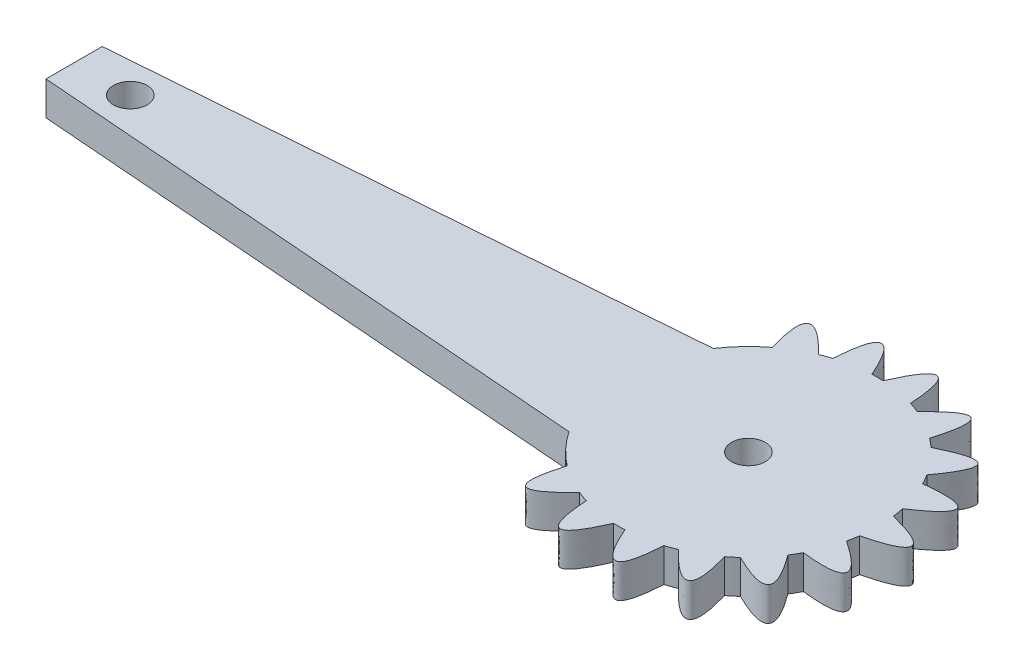
ISO-10303-21;
HEADER;
FILE_DESCRIPTION(('STEP AP214'),'2;1');
FILE_NAME('part.step','',(''),(''),'','','');
FILE_SCHEMA(('AUTOMOTIVE_DESIGN { 1 0 10303 214 1 1 1 1 }'));
ENDSEC;
DATA;
#1=APPLICATION_CONTEXT('core data for automotive mechanical design processes');
#2=APPLICATION_PROTOCOL_DEFINITION('international standard','automotive_design',2000,#1);
#3=PRODUCT_CONTEXT('',#1,'mechanical');
#4=PRODUCT('Part','Part','',(#3));
#5=PRODUCT_RELATED_PRODUCT_CATEGORY('part','',(#4));
#6=PRODUCT_DEFINITION_FORMATION('','',#4);
#7=PRODUCT_DEFINITION_CONTEXT('part definition',#1,'design');
#8=PRODUCT_DEFINITION('design','',#6,#7);
#9=PRODUCT_DEFINITION_SHAPE('','',#8);
#10=(LENGTH_UNIT() NAMED_UNIT(*) SI_UNIT(.MILLI.,.METRE.));
#11=(NAMED_UNIT(*) PLANE_ANGLE_UNIT() SI_UNIT($,.RADIAN.));
#12=(NAMED_UNIT(*) SI_UNIT($,.STERADIAN.) SOLID_ANGLE_UNIT());
#13=UNCERTAINTY_MEASURE_WITH_UNIT(LENGTH_MEASURE(1.E-05),#10,'distance_accuracy_value','');
#14=(GEOMETRIC_REPRESENTATION_CONTEXT(3) GLOBAL_UNCERTAINTY_ASSIGNED_CONTEXT((#13)) GLOBAL_UNIT_ASSIGNED_CONTEXT((#10,
#11,#12)) REPRESENTATION_CONTEXT('',''));
#15=CARTESIAN_POINT('',(0.,0.,0.));
#16=DIRECTION('',(0.,0.,1.));
#17=DIRECTION('',(1.,0.,0.));
#18=AXIS2_PLACEMENT_3D('',#15,#16,#17);
#19=CARTESIAN_POINT('',(52.9992435664006,3.,-15.6235634133468));
#20=CARTESIAN_POINT('',(51.2008079529003,3.,-21.7406476911319));
#21=CARTESIAN_POINT('',(55.5991405278024,3.,-17.1246146238774));
#22=B_SPLINE_CURVE_WITH_KNOTS('',2,(#19,#20,#21),.UNSPECIFIED.,.F.,.F.,(3,3),(0.,1.),.UNSPECIFIED.);
#23=DIRECTION('',(0.,-1.,0.));
#24=VECTOR('',#23,1.);
#25=SURFACE_OF_LINEAR_EXTRUSION('',#22,#24);
#26=CARTESIAN_POINT('',(52.9992435664006,0.,-15.6235634133468));
#27=CARTESIAN_POINT('',(51.2008079529003,0.,-21.7406476911319));
#28=CARTESIAN_POINT('',(55.5991405278024,0.,-17.1246146238774));
#29=B_SPLINE_CURVE_WITH_KNOTS('',2,(#26,#27,#28),.UNSPECIFIED.,.F.,.F.,(3,3),(0.,1.),.UNSPECIFIED.);
#30=CARTESIAN_POINT('',(52.9992435663991,0.,-15.6235634133487));
#31=VERTEX_POINT('',#30);
#32=CARTESIAN_POINT('',(55.5991405278014,0.,-17.1246146238798));
#33=VERTEX_POINT('',#32);
#34=EDGE_CURVE('E520',#31,#33,#29,.T.);
#35=ORIENTED_EDGE('',*,*,#34,.F.);
#36=DIRECTION('',(0.,-1.,0.));
#37=VECTOR('',#36,1.);
#38=CARTESIAN_POINT('',(52.9992435663991,3.,-15.6235634133487));
#39=LINE('',#38,#37);
#40=CARTESIAN_POINT('',(52.9992435663991,3.,-15.6235634133487));
#41=VERTEX_POINT('',#40);
#42=EDGE_CURVE('E11',#41,#31,#39,.T.);
#43=ORIENTED_EDGE('',*,*,#42,.F.);
#44=CARTESIAN_POINT('',(55.5991405278014,3.,-17.1246146238798));
#45=VERTEX_POINT('',#44);
#46=EDGE_CURVE('E435',#41,#45,#22,.T.);
#47=ORIENTED_EDGE('',*,*,#46,.T.);
#48=DIRECTION('',(0.,-1.,0.));
#49=VECTOR('',#48,1.);
#50=CARTESIAN_POINT('',(55.5991405278014,3.,-17.1246146238798));
#51=LINE('',#50,#49);
#52=EDGE_CURVE('E158',#45,#33,#51,.T.);
#53=ORIENTED_EDGE('',*,*,#52,.T.);
#54=EDGE_LOOP('',(#35,#43,#47,#53));
#55=FACE_BOUND('',#54,.T.);
#56=ADVANCED_FACE('F41',(#55),#25,.T.);
#57=CARTESIAN_POINT('',(60.,3.,-6.5));
#58=DIRECTION('',(0.,-1.,0.));
#59=DIRECTION('',(0.,0.,-1.));
#60=AXIS2_PLACEMENT_3D('',#57,#58,#59);
#61=CYLINDRICAL_SURFACE('',#60,11.5);
#62=CARTESIAN_POINT('',(60.,0.,-6.5));
#63=DIRECTION('',(0.,1.,0.));
#64=DIRECTION('',(0.,0.,1.));
#65=AXIS2_PLACEMENT_3D('',#62,#63,#64);
#66=CIRCLE('',#65,11.5);
#67=CARTESIAN_POINT('',(50.4582320769603,0.,-12.91908598656));
#68=VERTEX_POINT('',#67);
#69=EDGE_CURVE('E516',#31,#68,#66,.T.);
#70=ORIENTED_EDGE('',*,*,#69,.T.);
#71=DIRECTION('',(0.,-1.,0.));
#72=VECTOR('',#71,1.);
#73=CARTESIAN_POINT('',(50.4582320769603,3.,-12.91908598656));
#74=LINE('',#73,#72);
#75=CARTESIAN_POINT('',(50.4582320769603,3.,-12.91908598656));
#76=VERTEX_POINT('',#75);
#77=EDGE_CURVE('E50',#76,#68,#74,.T.);
#78=ORIENTED_EDGE('',*,*,#77,.F.);
#79=CARTESIAN_POINT('',(60.,3.,-6.5));
#80=DIRECTION('',(0.,1.,0.));
#81=DIRECTION('',(0.,0.,1.));
#82=AXIS2_PLACEMENT_3D('',#79,#80,#81);
#83=CIRCLE('',#82,11.5);
#84=EDGE_CURVE('E267',#41,#76,#83,.T.);
#85=ORIENTED_EDGE('',*,*,#84,.F.);
#86=ORIENTED_EDGE('',*,*,#42,.T.);
#87=EDGE_LOOP('',(#70,#78,#85,#86));
#88=FACE_BOUND('',#87,.T.);
#89=ADVANCED_FACE('F517',(#88),#61,.T.);
#90=CARTESIAN_POINT('',(-0.69483744026984,3.,-8.94603204347418));
#91=DIRECTION('',(-0.0774366813208004,0.,-0.996997272005305));
#92=DIRECTION('',(-0.996997272005305,0.,0.0774366813208004));
#93=AXIS2_PLACEMENT_3D('',#90,#91,#92);
#94=PLANE('',#93);
#95=DIRECTION('',(0.996997272005305,0.,-0.0774366813208004));
#96=VECTOR('',#95,1.);
#97=CARTESIAN_POINT('',(-0.69483744026984,0.,-8.94603204347418));
#98=LINE('',#97,#96);
#99=CARTESIAN_POINT('',(0.,0.,-9.));
#100=VERTEX_POINT('',#99);
#101=EDGE_CURVE('E511',#100,#68,#98,.T.);
#102=ORIENTED_EDGE('',*,*,#101,.F.);
#103=DIRECTION('',(0.,-1.,0.));
#104=VECTOR('',#103,1.);
#105=CARTESIAN_POINT('',(0.,3.,-9.));
#106=LINE('',#105,#104);
#107=CARTESIAN_POINT('',(0.,3.,-9.));
#108=VERTEX_POINT('',#107);
#109=EDGE_CURVE('E504',#108,#100,#106,.T.);
#110=ORIENTED_EDGE('',*,*,#109,.F.);
#111=DIRECTION('',(0.996997272005305,0.,-0.0774366813208004));
#112=VECTOR('',#111,1.);
#113=CARTESIAN_POINT('',(-0.69483744026984,3.,-8.94603204347418));
#114=LINE('',#113,#112);
#115=EDGE_CURVE('E433',#108,#76,#114,.T.);
#116=ORIENTED_EDGE('',*,*,#115,.T.);
#117=ORIENTED_EDGE('',*,*,#77,.T.);
#118=EDGE_LOOP('',(#102,#110,#116,#117));
#119=FACE_BOUND('',#118,.T.);
#120=ADVANCED_FACE('F509',(#119),#94,.T.);
#121=CARTESIAN_POINT('',(0.,3.,0.));
#122=DIRECTION('',(-1.,0.,0.));
#123=DIRECTION('',(0.,0.,1.));
#124=AXIS2_PLACEMENT_3D('',#121,#122,#123);
#125=PLANE('',#124);
#126=DIRECTION('',(0.,0.,-1.));
#127=VECTOR('',#126,1.);
#128=CARTESIAN_POINT('',(0.,0.,0.));
#129=LINE('',#128,#127);
#130=CARTESIAN_POINT('',(0.,0.,-4.));
#131=VERTEX_POINT('',#130);
#132=EDGE_CURVE('E527',#131,#100,#129,.T.);
#133=ORIENTED_EDGE('',*,*,#132,.F.);
#134=DIRECTION('',(0.,-1.,0.));
#135=VECTOR('',#134,1.);
#136=CARTESIAN_POINT('',(0.,3.,-4.));
#137=LINE('',#136,#135);
#138=CARTESIAN_POINT('',(0.,3.,-4.));
#139=VERTEX_POINT('',#138);
#140=EDGE_CURVE('E502',#139,#131,#137,.T.);
#141=ORIENTED_EDGE('',*,*,#140,.F.);
#142=DIRECTION('',(0.,0.,-1.));
#143=VECTOR('',#142,1.);
#144=CARTESIAN_POINT('',(0.,3.,0.));
#145=LINE('',#144,#143);
#146=EDGE_CURVE('E430',#139,#108,#145,.T.);
#147=ORIENTED_EDGE('',*,*,#146,.T.);
#148=ORIENTED_EDGE('',*,*,#109,.T.);
#149=EDGE_LOOP('',(#133,#141,#147,#148));
#150=FACE_BOUND('',#149,.T.);
#151=ADVANCED_FACE('F1095',(#150),#125,.T.);
#152=CARTESIAN_POINT('',(0.308816640119929,3.,-3.97601424154408));
#153=DIRECTION('',(0.0774366813208004,0.,-0.996997272005305));
#154=DIRECTION('',(-0.996997272005305,0.,-0.0774366813208004));
#155=AXIS2_PLACEMENT_3D('',#152,#153,#154);
#156=PLANE('',#155);
#157=DIRECTION('',(0.996997272005305,0.,0.0774366813208004));
#158=VECTOR('',#157,1.);
#159=CARTESIAN_POINT('',(0.308816640119929,0.,-3.97601424154408));
#160=LINE('',#159,#158);
#161=CARTESIAN_POINT('',(50.4582320769603,0.,-0.0809140134399738));
#162=VERTEX_POINT('',#161);
#163=EDGE_CURVE('E529',#131,#162,#160,.T.);
#164=ORIENTED_EDGE('',*,*,#163,.T.);
#165=DIRECTION('',(0.,-1.,0.));
#166=VECTOR('',#165,1.);
#167=CARTESIAN_POINT('',(50.4582320769603,3.,-0.0809140134399738));
#168=LINE('',#167,#166);
#169=CARTESIAN_POINT('',(50.4582320769603,3.,-0.0809140134399738));
#170=VERTEX_POINT('',#169);
#171=EDGE_CURVE('E499',#170,#162,#168,.T.);
#172=ORIENTED_EDGE('',*,*,#171,.F.);
#173=DIRECTION('',(0.996997272005305,0.,0.0774366813208004));
#174=VECTOR('',#173,1.);
#175=CARTESIAN_POINT('',(0.308816640119929,3.,-3.97601424154408));
#176=LINE('',#175,#174);
#177=EDGE_CURVE('E425',#139,#170,#176,.T.);
#178=ORIENTED_EDGE('',*,*,#177,.F.);
#179=ORIENTED_EDGE('',*,*,#140,.T.);
#180=EDGE_LOOP('',(#164,#172,#178,#179));
#181=FACE_BOUND('',#180,.T.);
#182=ADVANCED_FACE('F728',(#181),#156,.F.);
#183=CARTESIAN_POINT('',(52.9992435664049,0.,2.62356341335322));
#184=VERTEX_POINT('',#183);
#185=EDGE_CURVE('E522',#162,#184,#66,.T.);
#186=ORIENTED_EDGE('',*,*,#185,.T.);
#187=DIRECTION('',(0.,-1.,0.));
#188=VECTOR('',#187,1.);
#189=CARTESIAN_POINT('',(52.9992435664049,3.,2.62356341335322));
#190=LINE('',#189,#188);
#191=CARTESIAN_POINT('',(52.9992435664049,3.,2.62356341335322));
#192=VERTEX_POINT('',#191);
#193=EDGE_CURVE('E497',#192,#184,#190,.T.);
#194=ORIENTED_EDGE('',*,*,#193,.F.);
#195=EDGE_CURVE('E424',#170,#192,#83,.T.);
#196=ORIENTED_EDGE('',*,*,#195,.F.);
#197=ORIENTED_EDGE('',*,*,#171,.T.);
#198=EDGE_LOOP('',(#186,#194,#196,#197));
#199=FACE_BOUND('',#198,.T.);
#200=ADVANCED_FACE('F681',(#199),#61,.T.);
#201=CARTESIAN_POINT('',(55.5991405278086,3.,4.12461462388139));
#202=CARTESIAN_POINT('',(51.2008079529064,3.,8.74064769113579));
#203=CARTESIAN_POINT('',(52.9992435664068,3.,2.62356341335077));
#204=B_SPLINE_CURVE_WITH_KNOTS('',2,(#201,#202,#203),.UNSPECIFIED.,.F.,.F.,(3,3),(0.,1.),.UNSPECIFIED.);
#205=DIRECTION('',(0.,-1.,0.));
#206=VECTOR('',#205,1.);
#207=SURFACE_OF_LINEAR_EXTRUSION('',#204,#206);
#208=CARTESIAN_POINT('',(55.5991405278086,0.,4.12461462388139));
#209=CARTESIAN_POINT('',(51.2008079529064,0.,8.74064769113579));
#210=CARTESIAN_POINT('',(52.9992435664068,0.,2.62356341335077));
#211=B_SPLINE_CURVE_WITH_KNOTS('',2,(#208,#209,#210),.UNSPECIFIED.,.F.,.F.,(3,3),(0.,1.),.UNSPECIFIED.);
#212=CARTESIAN_POINT('',(55.5991405278081,0.,4.12461462388254));
#213=VERTEX_POINT('',#212);
#214=EDGE_CURVE('E534',#213,#184,#211,.T.);
#215=ORIENTED_EDGE('',*,*,#214,.F.);
#216=DIRECTION('',(0.,-1.,0.));
#217=VECTOR('',#216,1.);
#218=CARTESIAN_POINT('',(55.5991405278081,3.,4.12461462388254));
#219=LINE('',#218,#217);
#220=CARTESIAN_POINT('',(55.5991405278081,3.,4.12461462388254));
#221=VERTEX_POINT('',#220);
#222=EDGE_CURVE('E495',#221,#213,#219,.T.);
#223=ORIENTED_EDGE('',*,*,#222,.F.);
#224=EDGE_CURVE('E415',#221,#192,#204,.T.);
#225=ORIENTED_EDGE('',*,*,#224,.T.);
#226=ORIENTED_EDGE('',*,*,#193,.T.);
#227=EDGE_LOOP('',(#215,#223,#225,#226));
#228=FACE_BOUND('',#227,.T.);
#229=ADVANCED_FACE('F405',(#228),#207,.T.);
#230=CARTESIAN_POINT('',(56.5418833057077,0.,4.46774493360676));
#231=VERTEX_POINT('',#230);
#232=EDGE_CURVE('E539',#213,#231,#66,.T.);
#233=ORIENTED_EDGE('',*,*,#232,.T.);
#234=DIRECTION('',(0.,-1.,0.));
#235=VECTOR('',#234,1.);
#236=CARTESIAN_POINT('',(56.5418833057077,3.,4.46774493360676));
#237=LINE('',#236,#235);
#238=CARTESIAN_POINT('',(56.5418833057077,3.,4.46774493360676));
#239=VERTEX_POINT('',#238);
#240=EDGE_CURVE('E493',#239,#231,#237,.T.);
#241=ORIENTED_EDGE('',*,*,#240,.F.);
#242=EDGE_CURVE('E414',#221,#239,#83,.T.);
#243=ORIENTED_EDGE('',*,*,#242,.F.);
#244=ORIENTED_EDGE('',*,*,#222,.T.);
#245=EDGE_LOOP('',(#233,#241,#243,#244));
#246=FACE_BOUND('',#245,.T.);
#247=ADVANCED_FACE('F403',(#246),#61,.T.);
#248=CARTESIAN_POINT('',(59.4983770453061,3.,4.98905454819171));
#249=CARTESIAN_POINT('',(56.9440726721666,3.,10.8310250964564));
#250=CARTESIAN_POINT('',(56.5418833057083,3.,4.46774493360494));
#251=B_SPLINE_CURVE_WITH_KNOTS('',2,(#248,#249,#250),.UNSPECIFIED.,.F.,.F.,(3,3),(0.,1.),.UNSPECIFIED.);
#252=DIRECTION('',(0.,-1.,0.));
#253=VECTOR('',#252,1.);
#254=SURFACE_OF_LINEAR_EXTRUSION('',#251,#253);
#255=CARTESIAN_POINT('',(59.4983770453061,0.,4.98905454819171));
#256=CARTESIAN_POINT('',(56.9440726721666,0.,10.8310250964564));
#257=CARTESIAN_POINT('',(56.5418833057083,0.,4.46774493360494));
#258=B_SPLINE_CURVE_WITH_KNOTS('',2,(#255,#256,#257),.UNSPECIFIED.,.F.,.F.,(3,3),(0.,1.),.UNSPECIFIED.);
#259=CARTESIAN_POINT('',(59.4983770453061,0.,4.98905454819168));
#260=VERTEX_POINT('',#259);
#261=EDGE_CURVE('E540',#260,#231,#258,.T.);
#262=ORIENTED_EDGE('',*,*,#261,.F.);
#263=DIRECTION('',(0.,-1.,0.));
#264=VECTOR('',#263,1.);
#265=CARTESIAN_POINT('',(59.4983770453061,3.,4.98905454819168));
#266=LINE('',#265,#264);
#267=CARTESIAN_POINT('',(59.4983770453061,3.,4.98905454819168));
#268=VERTEX_POINT('',#267);
#269=EDGE_CURVE('E491',#268,#260,#266,.T.);
#270=ORIENTED_EDGE('',*,*,#269,.F.);
#271=EDGE_CURVE('E408',#268,#239,#251,.T.);
#272=ORIENTED_EDGE('',*,*,#271,.T.);
#273=ORIENTED_EDGE('',*,*,#240,.T.);
#274=EDGE_LOOP('',(#262,#270,#272,#273));
#275=FACE_BOUND('',#274,.T.);
#276=ADVANCED_FACE('F400',(#275),#254,.T.);
#277=CARTESIAN_POINT('',(60.5016229547086,0.,4.98905454819104));
#278=VERTEX_POINT('',#277);
#279=EDGE_CURVE('E548',#260,#278,#66,.T.);
#280=ORIENTED_EDGE('',*,*,#279,.T.);
#281=DIRECTION('',(0.,-1.,0.));
#282=VECTOR('',#281,1.);
#283=CARTESIAN_POINT('',(60.5016229547086,3.,4.98905454819104));
#284=LINE('',#283,#282);
#285=CARTESIAN_POINT('',(60.5016229547086,3.,4.98905454819104));
#286=VERTEX_POINT('',#285);
#287=EDGE_CURVE('E489',#286,#278,#284,.T.);
#288=ORIENTED_EDGE('',*,*,#287,.F.);
#289=EDGE_CURVE('E413',#268,#286,#83,.T.);
#290=ORIENTED_EDGE('',*,*,#289,.F.);
#291=ORIENTED_EDGE('',*,*,#269,.T.);
#292=EDGE_LOOP('',(#280,#288,#290,#291));
#293=FACE_BOUND('',#292,.T.);
#294=ADVANCED_FACE('F398',(#293),#61,.T.);
#295=CARTESIAN_POINT('',(63.4581166943064,3.,4.46774493360369));
#296=CARTESIAN_POINT('',(63.0559273278479,3.,10.8310250964552));
#297=CARTESIAN_POINT('',(60.5016229547086,3.,4.98905454819043));
#298=B_SPLINE_CURVE_WITH_KNOTS('',2,(#295,#296,#297),.UNSPECIFIED.,.F.,.F.,(3,3),(0.,1.),.UNSPECIFIED.);
#299=DIRECTION('',(0.,-1.,0.));
#300=VECTOR('',#299,1.);
#301=SURFACE_OF_LINEAR_EXTRUSION('',#298,#300);
#302=CARTESIAN_POINT('',(63.4581166943064,0.,4.46774493360369));
#303=CARTESIAN_POINT('',(63.0559273278479,0.,10.8310250964552));
#304=CARTESIAN_POINT('',(60.5016229547086,0.,4.98905454819043));
#305=B_SPLINE_CURVE_WITH_KNOTS('',2,(#302,#303,#304),.UNSPECIFIED.,.F.,.F.,(3,3),(0.,1.),.UNSPECIFIED.);
#306=CARTESIAN_POINT('',(63.458116694306,0.,4.46774493360244));
#307=VERTEX_POINT('',#306);
#308=EDGE_CURVE('E549',#307,#278,#305,.T.);
#309=ORIENTED_EDGE('',*,*,#308,.F.);
#310=DIRECTION('',(0.,-1.,0.));
#311=VECTOR('',#310,1.);
#312=CARTESIAN_POINT('',(63.458116694306,3.,4.46774493360244));
#313=LINE('',#312,#311);
#314=CARTESIAN_POINT('',(63.458116694306,3.,4.46774493360244));
#315=VERTEX_POINT('',#314);
#316=EDGE_CURVE('E487',#315,#307,#313,.T.);
#317=ORIENTED_EDGE('',*,*,#316,.F.);
#318=EDGE_CURVE('E381',#315,#286,#298,.T.);
#319=ORIENTED_EDGE('',*,*,#318,.T.);
#320=ORIENTED_EDGE('',*,*,#287,.T.);
#321=EDGE_LOOP('',(#309,#317,#319,#320));
#322=FACE_BOUND('',#321,.T.);
#323=ADVANCED_FACE('F395',(#322),#301,.T.);
#324=CARTESIAN_POINT('',(64.4008594722049,0.,4.12461462387714));
#325=VERTEX_POINT('',#324);
#326=EDGE_CURVE('E557',#307,#325,#66,.T.);
#327=ORIENTED_EDGE('',*,*,#326,.T.);
#328=DIRECTION('',(0.,-1.,0.));
#329=VECTOR('',#328,1.);
#330=CARTESIAN_POINT('',(64.4008594722049,3.,4.12461462387714));
#331=LINE('',#330,#329);
#332=CARTESIAN_POINT('',(64.4008594722049,3.,4.12461462387714));
#333=VERTEX_POINT('',#332);
#334=EDGE_CURVE('E485',#333,#325,#331,.T.);
#335=ORIENTED_EDGE('',*,*,#334,.F.);
#336=EDGE_CURVE('E380',#315,#333,#83,.T.);
#337=ORIENTED_EDGE('',*,*,#336,.F.);
#338=ORIENTED_EDGE('',*,*,#316,.T.);
#339=EDGE_LOOP('',(#327,#335,#337,#338));
#340=FACE_BOUND('',#339,.T.);
#341=ADVANCED_FACE('F393',(#340),#61,.T.);
#342=CARTESIAN_POINT('',(67.000756433607,3.,2.62356341334715));
#343=CARTESIAN_POINT('',(68.7991920471072,3.,8.74064769113221));
#344=CARTESIAN_POINT('',(64.4008594722052,3.,4.12461462387773));
#345=B_SPLINE_CURVE_WITH_KNOTS('',2,(#342,#343,#344),.UNSPECIFIED.,.F.,.F.,(3,3),(0.,1.),.UNSPECIFIED.);
#346=DIRECTION('',(0.,-1.,0.));
#347=VECTOR('',#346,1.);
#348=SURFACE_OF_LINEAR_EXTRUSION('',#345,#347);
#349=CARTESIAN_POINT('',(67.000756433607,0.,2.62356341334715));
#350=CARTESIAN_POINT('',(68.7991920471072,0.,8.74064769113221));
#351=CARTESIAN_POINT('',(64.4008594722052,0.,4.12461462387773));
#352=B_SPLINE_CURVE_WITH_KNOTS('',2,(#349,#350,#351),.UNSPECIFIED.,.F.,.F.,(3,3),(0.,1.),.UNSPECIFIED.);
#353=CARTESIAN_POINT('',(67.0007564336055,0.,2.62356341334522));
#354=VERTEX_POINT('',#353);
#355=EDGE_CURVE('E558',#354,#325,#352,.T.);
#356=ORIENTED_EDGE('',*,*,#355,.F.);
#357=DIRECTION('',(0.,-1.,0.));
#358=VECTOR('',#357,1.);
#359=CARTESIAN_POINT('',(67.0007564336055,3.,2.62356341334522));
#360=LINE('',#359,#358);
#361=CARTESIAN_POINT('',(67.0007564336055,3.,2.62356341334522));
#362=VERTEX_POINT('',#361);
#363=EDGE_CURVE('E483',#362,#354,#360,.T.);
#364=ORIENTED_EDGE('',*,*,#363,.F.);
#365=EDGE_CURVE('E371',#362,#333,#345,.T.);
#366=ORIENTED_EDGE('',*,*,#365,.T.);
#367=ORIENTED_EDGE('',*,*,#334,.T.);
#368=EDGE_LOOP('',(#356,#364,#366,#367));
#369=FACE_BOUND('',#368,.T.);
#370=ADVANCED_FACE('F389',(#369),#348,.T.);
#371=CARTESIAN_POINT('',(67.7692873875847,0.,1.97868937331223));
#372=VERTEX_POINT('',#371);
#373=EDGE_CURVE('E566',#354,#372,#66,.T.);
#374=ORIENTED_EDGE('',*,*,#373,.T.);
#375=DIRECTION('',(0.,-1.,0.));
#376=VECTOR('',#375,1.);
#377=CARTESIAN_POINT('',(67.7692873875847,3.,1.97868937331223));
#378=LINE('',#377,#376);
#379=CARTESIAN_POINT('',(67.7692873875847,3.,1.97868937331223));
#380=VERTEX_POINT('',#379);
#381=EDGE_CURVE('E481',#380,#372,#378,.T.);
#382=ORIENTED_EDGE('',*,*,#381,.F.);
#383=EDGE_CURVE('E370',#362,#380,#83,.T.);
#384=ORIENTED_EDGE('',*,*,#383,.F.);
#385=ORIENTED_EDGE('',*,*,#363,.T.);
#386=EDGE_LOOP('',(#374,#382,#384,#385));
#387=FACE_BOUND('',#386,.T.);
#388=ADVANCED_FACE('F392',(#387),#61,.T.);
#389=CARTESIAN_POINT('',(69.6990016268539,3.,-0.321054504014456));
#390=CARTESIAN_POINT('',(73.4811443432419,3.,4.81202324625434));
#391=CARTESIAN_POINT('',(67.7692873875858,3.,1.9786893733135));
#392=B_SPLINE_CURVE_WITH_KNOTS('',2,(#389,#390,#391),.UNSPECIFIED.,.F.,.F.,(3,3),(0.,1.),.UNSPECIFIED.);
#393=DIRECTION('',(0.,-1.,0.));
#394=VECTOR('',#393,1.);
#395=SURFACE_OF_LINEAR_EXTRUSION('',#392,#394);
#396=CARTESIAN_POINT('',(69.6990016268539,0.,-0.321054504014456));
#397=CARTESIAN_POINT('',(73.4811443432419,0.,4.81202324625434));
#398=CARTESIAN_POINT('',(67.7692873875858,0.,1.9786893733135));
#399=B_SPLINE_CURVE_WITH_KNOTS('',2,(#396,#397,#398),.UNSPECIFIED.,.F.,.F.,(3,3),(0.,1.),.UNSPECIFIED.);
#400=CARTESIAN_POINT('',(69.6990016268512,0.,-0.321054504016212));
#401=VERTEX_POINT('',#400);
#402=EDGE_CURVE('E567',#401,#372,#399,.T.);
#403=ORIENTED_EDGE('',*,*,#402,.F.);
#404=DIRECTION('',(0.,-1.,0.));
#405=VECTOR('',#404,1.);
#406=CARTESIAN_POINT('',(69.6990016268512,3.,-0.321054504016212));
#407=LINE('',#406,#405);
#408=CARTESIAN_POINT('',(69.6990016268512,3.,-0.321054504016212));
#409=VERTEX_POINT('',#408);
#410=EDGE_CURVE('E479',#409,#401,#407,.T.);
#411=ORIENTED_EDGE('',*,*,#410,.F.);
#412=EDGE_CURVE('E361',#409,#380,#392,.T.);
#413=ORIENTED_EDGE('',*,*,#412,.T.);
#414=ORIENTED_EDGE('',*,*,#381,.T.);
#415=EDGE_LOOP('',(#403,#411,#413,#414));
#416=FACE_BOUND('',#415,.T.);
#417=ADVANCED_FACE('F351',(#416),#395,.T.);
#418=CARTESIAN_POINT('',(70.2006245815519,0.,-1.18989094780166));
#419=VERTEX_POINT('',#418);
#420=EDGE_CURVE('E575',#401,#419,#66,.T.);
#421=ORIENTED_EDGE('',*,*,#420,.T.);
#422=DIRECTION('',(0.,-1.,0.));
#423=VECTOR('',#422,1.);
#424=CARTESIAN_POINT('',(70.2006245815519,3.,-1.18989094780166));
#425=LINE('',#424,#423);
#426=CARTESIAN_POINT('',(70.2006245815519,3.,-1.18989094780166));
#427=VERTEX_POINT('',#426);
#428=EDGE_CURVE('E477',#427,#419,#425,.T.);
#429=ORIENTED_EDGE('',*,*,#428,.F.);
#430=EDGE_CURVE('E360',#409,#427,#83,.T.);
#431=ORIENTED_EDGE('',*,*,#430,.F.);
#432=ORIENTED_EDGE('',*,*,#410,.T.);
#433=EDGE_LOOP('',(#421,#429,#431,#432));
#434=FACE_BOUND('',#433,.T.);
#435=ADVANCED_FACE('F349',(#434),#61,.T.);
#436=CARTESIAN_POINT('',(71.2274040818838,3.,-4.01094443971525));
#437=CARTESIAN_POINT('',(76.5370716710815,3.,-0.480998149804505));
#438=CARTESIAN_POINT('',(70.2006245815541,3.,-1.18989094780053));
#439=B_SPLINE_CURVE_WITH_KNOTS('',2,(#436,#437,#438),.UNSPECIFIED.,.F.,.F.,(3,3),(0.,1.),.UNSPECIFIED.);
#440=DIRECTION('',(0.,-1.,0.));
#441=VECTOR('',#440,1.);
#442=SURFACE_OF_LINEAR_EXTRUSION('',#439,#441);
#443=CARTESIAN_POINT('',(71.2274040818838,0.,-4.01094443971525));
#444=CARTESIAN_POINT('',(76.5370716710815,0.,-0.480998149804505));
#445=CARTESIAN_POINT('',(70.2006245815541,0.,-1.18989094780053));
#446=B_SPLINE_CURVE_WITH_KNOTS('',2,(#443,#444,#445),.UNSPECIFIED.,.F.,.F.,(3,3),(0.,1.),.UNSPECIFIED.);
#447=CARTESIAN_POINT('',(71.2274040818802,0.,-4.01094443971605));
#448=VERTEX_POINT('',#447);
#449=EDGE_CURVE('E576',#448,#419,#446,.T.);
#450=ORIENTED_EDGE('',*,*,#449,.F.);
#451=DIRECTION('',(0.,-1.,0.));
#452=VECTOR('',#451,1.);
#453=CARTESIAN_POINT('',(71.2274040818802,3.,-4.01094443971605));
#454=LINE('',#453,#452);
#455=CARTESIAN_POINT('',(71.2274040818802,3.,-4.01094443971605));
#456=VERTEX_POINT('',#455);
#457=EDGE_CURVE('E475',#456,#448,#454,.T.);
#458=ORIENTED_EDGE('',*,*,#457,.F.);
#459=EDGE_CURVE('E354',#456,#427,#439,.T.);
#460=ORIENTED_EDGE('',*,*,#459,.T.);
#461=ORIENTED_EDGE('',*,*,#428,.T.);
#462=EDGE_LOOP('',(#450,#458,#460,#461));
#463=FACE_BOUND('',#462,.T.);
#464=ADVANCED_FACE('F346',(#463),#442,.T.);
#465=CARTESIAN_POINT('',(71.4016159057993,0.,-4.99894878947325));
#466=VERTEX_POINT('',#465);
#467=EDGE_CURVE('E584',#448,#466,#66,.T.);
#468=ORIENTED_EDGE('',*,*,#467,.T.);
#469=DIRECTION('',(0.,-1.,0.));
#470=VECTOR('',#469,1.);
#471=CARTESIAN_POINT('',(71.4016159057993,3.,-4.99894878947325));
#472=LINE('',#471,#470);
#473=CARTESIAN_POINT('',(71.4016159057993,3.,-4.99894878947325));
#474=VERTEX_POINT('',#473);
#475=EDGE_CURVE('E473',#474,#466,#472,.T.);
#476=ORIENTED_EDGE('',*,*,#475,.F.);
#477=EDGE_CURVE('E359',#456,#474,#83,.T.);
#478=ORIENTED_EDGE('',*,*,#477,.F.);
#479=ORIENTED_EDGE('',*,*,#457,.T.);
#480=EDGE_LOOP('',(#468,#476,#478,#479));
#481=FACE_BOUND('',#480,.T.);
#482=ADVANCED_FACE('F344',(#481),#61,.T.);
#483=CARTESIAN_POINT('',(71.4016159058021,3.,-8.00105121053409));
#484=CARTESIAN_POINT('',(77.5983840942045,3.,-6.50000000000346));
#485=CARTESIAN_POINT('',(71.4016159058021,3.,-4.99894878947289));
#486=B_SPLINE_CURVE_WITH_KNOTS('',2,(#483,#484,#485),.UNSPECIFIED.,.F.,.F.,(3,3),(0.,1.),.UNSPECIFIED.);
#487=DIRECTION('',(0.,-1.,0.));
#488=VECTOR('',#487,1.);
#489=SURFACE_OF_LINEAR_EXTRUSION('',#486,#488);
#490=CARTESIAN_POINT('',(71.4016159058021,0.,-8.00105121053409));
#491=CARTESIAN_POINT('',(77.5983840942045,0.,-6.50000000000346));
#492=CARTESIAN_POINT('',(71.4016159058021,0.,-4.99894878947289));
#493=B_SPLINE_CURVE_WITH_KNOTS('',2,(#490,#491,#492),.UNSPECIFIED.,.F.,.F.,(3,3),(0.,1.),.UNSPECIFIED.);
#494=CARTESIAN_POINT('',(71.4016159057984,0.,-8.00105121053361));
#495=VERTEX_POINT('',#494);
#496=EDGE_CURVE('E585',#495,#466,#493,.T.);
#497=ORIENTED_EDGE('',*,*,#496,.F.);
#498=DIRECTION('',(0.,-1.,0.));
#499=VECTOR('',#498,1.);
#500=CARTESIAN_POINT('',(71.4016159057984,3.,-8.00105121053361));
#501=LINE('',#500,#499);
#502=CARTESIAN_POINT('',(71.4016159057984,3.,-8.00105121053361));
#503=VERTEX_POINT('',#502);
#504=EDGE_CURVE('E471',#503,#495,#501,.T.);
#505=ORIENTED_EDGE('',*,*,#504,.F.);
#506=EDGE_CURVE('E327',#503,#474,#486,.T.);
#507=ORIENTED_EDGE('',*,*,#506,.T.);
#508=ORIENTED_EDGE('',*,*,#475,.T.);
#509=EDGE_LOOP('',(#497,#505,#507,#508));
#510=FACE_BOUND('',#509,.T.);
#511=ADVANCED_FACE('F341',(#510),#489,.T.);
#512=CARTESIAN_POINT('',(71.2274040818787,0.,-8.98905556029072));
#513=VERTEX_POINT('',#512);
#514=EDGE_CURVE('E593',#495,#513,#66,.T.);
#515=ORIENTED_EDGE('',*,*,#514,.T.);
#516=DIRECTION('',(0.,-1.,0.));
#517=VECTOR('',#516,1.);
#518=CARTESIAN_POINT('',(71.2274040818787,3.,-8.98905556029072));
#519=LINE('',#518,#517);
#520=CARTESIAN_POINT('',(71.2274040818787,3.,-8.98905556029072));
#521=VERTEX_POINT('',#520);
#522=EDGE_CURVE('E469',#521,#513,#519,.T.);
#523=ORIENTED_EDGE('',*,*,#522,.F.);
#524=EDGE_CURVE('E326',#503,#521,#83,.T.);
#525=ORIENTED_EDGE('',*,*,#524,.F.);
#526=ORIENTED_EDGE('',*,*,#504,.T.);
#527=EDGE_LOOP('',(#515,#523,#525,#526));
#528=FACE_BOUND('',#527,.T.);
#529=ADVANCED_FACE('F339',(#528),#61,.T.);
#530=CARTESIAN_POINT('',(70.2006245815516,3.,-11.810109052206));
#531=CARTESIAN_POINT('',(76.537071671079,3.,-12.5190018502019));
#532=CARTESIAN_POINT('',(71.2274040818812,3.,-8.98905556029129));
#533=B_SPLINE_CURVE_WITH_KNOTS('',2,(#530,#531,#532),.UNSPECIFIED.,.F.,.F.,(3,3),(0.,1.),.UNSPECIFIED.);
#534=DIRECTION('',(0.,-1.,0.));
#535=VECTOR('',#534,1.);
#536=SURFACE_OF_LINEAR_EXTRUSION('',#533,#535);
#537=CARTESIAN_POINT('',(70.2006245815516,0.,-11.810109052206));
#538=CARTESIAN_POINT('',(76.537071671079,0.,-12.5190018502019));
#539=CARTESIAN_POINT('',(71.2274040818812,0.,-8.98905556029129));
#540=B_SPLINE_CURVE_WITH_KNOTS('',2,(#537,#538,#539),.UNSPECIFIED.,.F.,.F.,(3,3),(0.,1.),.UNSPECIFIED.);
#541=CARTESIAN_POINT('',(70.2006245815487,0.,-11.8101090522045));
#542=VERTEX_POINT('',#541);
#543=EDGE_CURVE('E594',#542,#513,#540,.T.);
#544=ORIENTED_EDGE('',*,*,#543,.F.);
#545=DIRECTION('',(0.,-1.,0.));
#546=VECTOR('',#545,1.);
#547=CARTESIAN_POINT('',(70.2006245815487,3.,-11.8101090522045));
#548=LINE('',#547,#546);
#549=CARTESIAN_POINT('',(70.2006245815487,3.,-11.8101090522045));
#550=VERTEX_POINT('',#549);
#551=EDGE_CURVE('E467',#550,#542,#548,.T.);
#552=ORIENTED_EDGE('',*,*,#551,.F.);
#553=EDGE_CURVE('E317',#550,#521,#533,.T.);
#554=ORIENTED_EDGE('',*,*,#553,.T.);
#555=ORIENTED_EDGE('',*,*,#522,.T.);
#556=EDGE_LOOP('',(#544,#552,#554,#555));
#557=FACE_BOUND('',#556,.T.);
#558=ADVANCED_FACE('F335',(#557),#536,.T.);
#559=CARTESIAN_POINT('',(69.6990016268474,0.,-12.6789454959897));
#560=VERTEX_POINT('',#559);
#561=EDGE_CURVE('E602',#542,#560,#66,.T.);
#562=ORIENTED_EDGE('',*,*,#561,.T.);
#563=DIRECTION('',(0.,-1.,0.));
#564=VECTOR('',#563,1.);
#565=CARTESIAN_POINT('',(69.6990016268474,3.,-12.6789454959897));
#566=LINE('',#565,#564);
#567=CARTESIAN_POINT('',(69.6990016268474,3.,-12.6789454959897));
#568=VERTEX_POINT('',#567);
#569=EDGE_CURVE('E465',#568,#560,#566,.T.);
#570=ORIENTED_EDGE('',*,*,#569,.F.);
#571=EDGE_CURVE('E316',#550,#568,#83,.T.);
#572=ORIENTED_EDGE('',*,*,#571,.F.);
#573=ORIENTED_EDGE('',*,*,#551,.T.);
#574=EDGE_LOOP('',(#562,#570,#572,#573));
#575=FACE_BOUND('',#574,.T.);
#576=ADVANCED_FACE('F338',(#575),#61,.T.);
#577=CARTESIAN_POINT('',(67.7692873875811,3.,-14.9786893733188));
#578=CARTESIAN_POINT('',(73.4811443432373,3.,-17.8120232462595));
#579=CARTESIAN_POINT('',(69.6990016268492,3.,-12.6789454959908));
#580=B_SPLINE_CURVE_WITH_KNOTS('',2,(#577,#578,#579),.UNSPECIFIED.,.F.,.F.,(3,3),(0.,1.),.UNSPECIFIED.);
#581=DIRECTION('',(0.,-1.,0.));
#582=VECTOR('',#581,1.);
#583=SURFACE_OF_LINEAR_EXTRUSION('',#580,#582);
#584=CARTESIAN_POINT('',(67.7692873875811,0.,-14.9786893733188));
#585=CARTESIAN_POINT('',(73.4811443432373,0.,-17.8120232462595));
#586=CARTESIAN_POINT('',(69.6990016268492,0.,-12.6789454959908));
#587=B_SPLINE_CURVE_WITH_KNOTS('',2,(#584,#585,#586),.UNSPECIFIED.,.F.,.F.,(3,3),(0.,1.),.UNSPECIFIED.);
#588=CARTESIAN_POINT('',(67.7692873875795,0.,-14.978689373317));
#589=VERTEX_POINT('',#588);
#590=EDGE_CURVE('E603',#589,#560,#587,.T.);
#591=ORIENTED_EDGE('',*,*,#590,.F.);
#592=DIRECTION('',(0.,-1.,0.));
#593=VECTOR('',#592,1.);
#594=CARTESIAN_POINT('',(67.7692873875795,3.,-14.978689373317));
#595=LINE('',#594,#593);
#596=CARTESIAN_POINT('',(67.7692873875795,3.,-14.978689373317));
#597=VERTEX_POINT('',#596);
#598=EDGE_CURVE('E463',#597,#589,#595,.T.);
#599=ORIENTED_EDGE('',*,*,#598,.F.);
#600=EDGE_CURVE('E307',#597,#568,#580,.T.);
#601=ORIENTED_EDGE('',*,*,#600,.T.);
#602=ORIENTED_EDGE('',*,*,#569,.T.);
#603=EDGE_LOOP('',(#591,#599,#601,#602));
#604=FACE_BOUND('',#603,.T.);
#605=ADVANCED_FACE('F298',(#604),#583,.T.);
#606=CARTESIAN_POINT('',(67.0007564335999,0.,-15.6235634133495));
#607=VERTEX_POINT('',#606);
#608=EDGE_CURVE('E611',#589,#607,#66,.T.);
#609=ORIENTED_EDGE('',*,*,#608,.T.);
#610=DIRECTION('',(0.,-1.,0.));
#611=VECTOR('',#610,1.);
#612=CARTESIAN_POINT('',(67.0007564335999,3.,-15.6235634133495));
#613=LINE('',#612,#611);
#614=CARTESIAN_POINT('',(67.0007564335999,3.,-15.6235634133495));
#615=VERTEX_POINT('',#614);
#616=EDGE_CURVE('E461',#615,#607,#613,.T.);
#617=ORIENTED_EDGE('',*,*,#616,.F.);
#618=EDGE_CURVE('E306',#597,#615,#83,.T.);
#619=ORIENTED_EDGE('',*,*,#618,.F.);
#620=ORIENTED_EDGE('',*,*,#598,.T.);
#621=EDGE_LOOP('',(#609,#617,#619,#620));
#622=FACE_BOUND('',#621,.T.);
#623=ADVANCED_FACE('F296',(#622),#61,.T.);
#624=CARTESIAN_POINT('',(64.4008594721988,3.,-17.1246146238811));
#625=CARTESIAN_POINT('',(68.7991920471009,3.,-21.7406476911355));
#626=CARTESIAN_POINT('',(67.0007564336006,3.,-15.6235634133505));
#627=B_SPLINE_CURVE_WITH_KNOTS('',2,(#624,#625,#626),.UNSPECIFIED.,.F.,.F.,(3,3),(0.,1.),.UNSPECIFIED.);
#628=DIRECTION('',(0.,-1.,0.));
#629=VECTOR('',#628,1.);
#630=SURFACE_OF_LINEAR_EXTRUSION('',#627,#629);
#631=CARTESIAN_POINT('',(64.4008594721988,0.,-17.1246146238811));
#632=CARTESIAN_POINT('',(68.7991920471009,0.,-21.7406476911355));
#633=CARTESIAN_POINT('',(67.0007564336006,0.,-15.6235634133505));
#634=B_SPLINE_CURVE_WITH_KNOTS('',2,(#631,#632,#633),.UNSPECIFIED.,.F.,.F.,(3,3),(0.,1.),.UNSPECIFIED.);
#635=CARTESIAN_POINT('',(64.4008594721983,0.,-17.1246146238799));
#636=VERTEX_POINT('',#635);
#637=EDGE_CURVE('E612',#636,#607,#634,.T.);
#638=ORIENTED_EDGE('',*,*,#637,.F.);
#639=DIRECTION('',(0.,-1.,0.));
#640=VECTOR('',#639,1.);
#641=CARTESIAN_POINT('',(64.4008594721983,3.,-17.1246146238799));
#642=LINE('',#641,#640);
#643=CARTESIAN_POINT('',(64.4008594721983,3.,-17.1246146238799));
#644=VERTEX_POINT('',#643);
#645=EDGE_CURVE('E459',#644,#636,#642,.T.);
#646=ORIENTED_EDGE('',*,*,#645,.F.);
#647=EDGE_CURVE('E301',#644,#615,#627,.T.);
#648=ORIENTED_EDGE('',*,*,#647,.T.);
#649=ORIENTED_EDGE('',*,*,#616,.T.);
#650=EDGE_LOOP('',(#638,#646,#648,#649));
#651=FACE_BOUND('',#650,.T.);
#652=ADVANCED_FACE('F293',(#651),#630,.T.);
#653=CARTESIAN_POINT('',(63.4581166942991,0.,-17.4677449336046));
#654=VERTEX_POINT('',#653);
#655=EDGE_CURVE('E620',#636,#654,#66,.T.);
#656=ORIENTED_EDGE('',*,*,#655,.T.);
#657=DIRECTION('',(0.,-1.,0.));
#658=VECTOR('',#657,1.);
#659=CARTESIAN_POINT('',(63.4581166942991,3.,-17.4677449336046));
#660=LINE('',#659,#658);
#661=CARTESIAN_POINT('',(63.4581166942991,3.,-17.4677449336046));
#662=VERTEX_POINT('',#661);
#663=EDGE_CURVE('E457',#662,#654,#660,.T.);
#664=ORIENTED_EDGE('',*,*,#663,.F.);
#665=EDGE_CURVE('E253',#644,#662,#83,.T.);
#666=ORIENTED_EDGE('',*,*,#665,.F.);
#667=ORIENTED_EDGE('',*,*,#645,.T.);
#668=EDGE_LOOP('',(#656,#664,#666,#667));
#669=FACE_BOUND('',#668,.T.);
#670=ADVANCED_FACE('F291',(#669),#61,.T.);
#671=CARTESIAN_POINT('',(60.5016229547014,3.,-17.9890545481914));
#672=CARTESIAN_POINT('',(63.0559273278407,3.,-23.8310250964561));
#673=CARTESIAN_POINT('',(63.4581166942991,3.,-17.4677449336046));
#674=B_SPLINE_CURVE_WITH_KNOTS('',2,(#671,#672,#673),.UNSPECIFIED.,.F.,.F.,(3,3),(0.,1.),.UNSPECIFIED.);
#675=DIRECTION('',(0.,-1.,0.));
#676=VECTOR('',#675,1.);
#677=SURFACE_OF_LINEAR_EXTRUSION('',#674,#676);
#678=CARTESIAN_POINT('',(60.5016229547014,0.,-17.9890545481914));
#679=CARTESIAN_POINT('',(63.0559273278407,0.,-23.8310250964561));
#680=CARTESIAN_POINT('',(63.4581166942991,0.,-17.4677449336046));
#681=B_SPLINE_CURVE_WITH_KNOTS('',2,(#678,#679,#680),.UNSPECIFIED.,.F.,.F.,(3,3),(0.,1.),.UNSPECIFIED.);
#682=CARTESIAN_POINT('',(60.5016229547014,0.,-17.9890545481914));
#683=VERTEX_POINT('',#682);
#684=EDGE_CURVE('E621',#683,#654,#681,.T.);
#685=ORIENTED_EDGE('',*,*,#684,.F.);
#686=DIRECTION('',(0.,-1.,0.));
#687=VECTOR('',#686,1.);
#688=CARTESIAN_POINT('',(60.5016229547014,3.,-17.9890545481914));
#689=LINE('',#688,#687);
#690=CARTESIAN_POINT('',(60.5016229547014,3.,-17.9890545481914));
#691=VERTEX_POINT('',#690);
#692=EDGE_CURVE('E262',#691,#683,#689,.T.);
#693=ORIENTED_EDGE('',*,*,#692,.F.);
#694=EDGE_CURVE('E250',#691,#662,#674,.T.);
#695=ORIENTED_EDGE('',*,*,#694,.T.);
#696=ORIENTED_EDGE('',*,*,#663,.T.);
#697=EDGE_LOOP('',(#685,#693,#695,#696));
#698=FACE_BOUND('',#697,.T.);
#699=ADVANCED_FACE('F288',(#698),#677,.T.);
#700=CARTESIAN_POINT('',(59.4983770452989,0.,-17.9890545481914));
#701=VERTEX_POINT('',#700);
#702=EDGE_CURVE('E258',#683,#701,#66,.T.);
#703=ORIENTED_EDGE('',*,*,#702,.T.);
#704=DIRECTION('',(0.,-1.,0.));
#705=VECTOR('',#704,1.);
#706=CARTESIAN_POINT('',(59.4983770452989,3.,-17.9890545481914));
#707=LINE('',#706,#705);
#708=CARTESIAN_POINT('',(59.4983770452989,3.,-17.9890545481914));
#709=VERTEX_POINT('',#708);
#710=EDGE_CURVE('E255',#709,#701,#707,.T.);
#711=ORIENTED_EDGE('',*,*,#710,.F.);
#712=EDGE_CURVE('E243',#691,#709,#83,.T.);
#713=ORIENTED_EDGE('',*,*,#712,.F.);
#714=ORIENTED_EDGE('',*,*,#692,.T.);
#715=EDGE_LOOP('',(#703,#711,#713,#714));
#716=FACE_BOUND('',#715,.T.);
#717=ADVANCED_FACE('F256',(#716),#61,.T.);
#718=CARTESIAN_POINT('',(56.5418833057012,3.,-17.4677449336033));
#719=CARTESIAN_POINT('',(56.9440726721597,3.,-23.8310250964548));
#720=CARTESIAN_POINT('',(59.498377045299,3.,-17.9890545481901));
#721=B_SPLINE_CURVE_WITH_KNOTS('',2,(#718,#719,#720),.UNSPECIFIED.,.F.,.F.,(3,3),(0.,1.),.UNSPECIFIED.);
#722=DIRECTION('',(0.,-1.,0.));
#723=VECTOR('',#722,1.);
#724=SURFACE_OF_LINEAR_EXTRUSION('',#721,#723);
#725=CARTESIAN_POINT('',(56.5418833057012,0.,-17.4677449336033));
#726=CARTESIAN_POINT('',(56.9440726721597,0.,-23.8310250964548));
#727=CARTESIAN_POINT('',(59.498377045299,0.,-17.9890545481901));
#728=B_SPLINE_CURVE_WITH_KNOTS('',2,(#725,#726,#727),.UNSPECIFIED.,.F.,.F.,(3,3),(0.,1.),.UNSPECIFIED.);
#729=CARTESIAN_POINT('',(56.5418833057008,0.,-17.4677449336046));
#730=VERTEX_POINT('',#729);
#731=EDGE_CURVE('E628',#730,#701,#728,.T.);
#732=ORIENTED_EDGE('',*,*,#731,.F.);
#733=DIRECTION('',(0.,-1.,0.));
#734=VECTOR('',#733,1.);
#735=CARTESIAN_POINT('',(56.5418833057008,3.,-17.4677449336046));
#736=LINE('',#735,#734);
#737=CARTESIAN_POINT('',(56.5418833057008,3.,-17.4677449336046));
#738=VERTEX_POINT('',#737);
#739=EDGE_CURVE('E151',#738,#730,#736,.T.);
#740=ORIENTED_EDGE('',*,*,#739,.F.);
#741=EDGE_CURVE('E248',#738,#709,#721,.T.);
#742=ORIENTED_EDGE('',*,*,#741,.T.);
#743=ORIENTED_EDGE('',*,*,#710,.T.);
#744=EDGE_LOOP('',(#732,#740,#742,#743));
#745=FACE_BOUND('',#744,.T.);
#746=ADVANCED_FACE('F264',(#745),#724,.T.);
#747=CARTESIAN_POINT('',(60.,3.,-6.5));
#748=DIRECTION('',(0.,-1.,0.));
#749=DIRECTION('',(0.,0.,-1.));
#750=AXIS2_PLACEMENT_3D('',#747,#748,#749);
#751=CYLINDRICAL_SURFACE('',#750,1.5);
#752=CARTESIAN_POINT('',(60.,3.,-6.5));
#753=DIRECTION('',(0.,1.,0.));
#754=DIRECTION('',(0.,0.,1.));
#755=AXIS2_PLACEMENT_3D('',#752,#753,#754);
#756=CIRCLE('',#755,1.5);
#757=CARTESIAN_POINT('',(60.,3.,-5.));
#758=VERTEX_POINT('',#757);
#759=EDGE_CURVE('E266',#758,#758,#756,.T.);
#760=ORIENTED_EDGE('',*,*,#759,.T.);
#761=EDGE_LOOP('',(#760));
#762=FACE_BOUND('',#761,.T.);
#763=CARTESIAN_POINT('',(60.,0.,-6.5));
#764=DIRECTION('',(0.,1.,0.));
#765=DIRECTION('',(0.,0.,1.));
#766=AXIS2_PLACEMENT_3D('',#763,#764,#765);
#767=CIRCLE('',#766,1.5);
#768=CARTESIAN_POINT('',(60.,0.,-5.));
#769=VERTEX_POINT('',#768);
#770=EDGE_CURVE('E444',#769,#769,#767,.T.);
#771=ORIENTED_EDGE('',*,*,#770,.F.);
#772=EDGE_LOOP('',(#771));
#773=FACE_BOUND('',#772,.T.);
#774=ADVANCED_FACE('F285',(#762,#773),#751,.F.);
#775=EDGE_CURVE('E449',#730,#33,#66,.T.);
#776=ORIENTED_EDGE('',*,*,#775,.T.);
#777=ORIENTED_EDGE('',*,*,#52,.F.);
#778=EDGE_CURVE('E58',#738,#45,#83,.T.);
#779=ORIENTED_EDGE('',*,*,#778,.F.);
#780=ORIENTED_EDGE('',*,*,#739,.T.);
#781=EDGE_LOOP('',(#776,#777,#779,#780));
#782=FACE_BOUND('',#781,.T.);
#783=ADVANCED_FACE('F286',(#782),#61,.T.);
#784=CARTESIAN_POINT('',(5.,3.,-6.5));
#785=DIRECTION('',(0.,-1.,0.));
#786=DIRECTION('',(0.,0.,-1.));
#787=AXIS2_PLACEMENT_3D('',#784,#785,#786);
#788=CYLINDRICAL_SURFACE('',#787,1.5);
#789=CARTESIAN_POINT('',(5.,3.,-6.5));
#790=DIRECTION('',(0.,1.,0.));
#791=DIRECTION('',(0.,0.,1.));
#792=AXIS2_PLACEMENT_3D('',#789,#790,#791);
#793=CIRCLE('',#792,1.5);
#794=CARTESIAN_POINT('',(5.,3.,-5.));
#795=VERTEX_POINT('',#794);
#796=EDGE_CURVE('E454',#795,#795,#793,.T.);
#797=ORIENTED_EDGE('',*,*,#796,.T.);
#798=EDGE_LOOP('',(#797));
#799=FACE_BOUND('',#798,.T.);
#800=CARTESIAN_POINT('',(5.,0.,-6.5));
#801=DIRECTION('',(0.,1.,0.));
#802=DIRECTION('',(0.,0.,1.));
#803=AXIS2_PLACEMENT_3D('',#800,#801,#802);
#804=CIRCLE('',#803,1.5);
#805=CARTESIAN_POINT('',(5.,0.,-5.));
#806=VERTEX_POINT('',#805);
#807=EDGE_CURVE('E439',#806,#806,#804,.T.);
#808=ORIENTED_EDGE('',*,*,#807,.F.);
#809=EDGE_LOOP('',(#808));
#810=FACE_BOUND('',#809,.T.);
#811=ADVANCED_FACE('F747',(#799,#810),#788,.F.);
#812=CARTESIAN_POINT('',(0.,3.,0.));
#813=DIRECTION('',(0.,1.,0.));
#814=DIRECTION('',(0.,0.,1.));
#815=AXIS2_PLACEMENT_3D('',#812,#813,#814);
#816=PLANE('',#815);
#817=ORIENTED_EDGE('',*,*,#46,.F.);
#818=ORIENTED_EDGE('',*,*,#84,.T.);
#819=ORIENTED_EDGE('',*,*,#115,.F.);
#820=ORIENTED_EDGE('',*,*,#146,.F.);
#821=ORIENTED_EDGE('',*,*,#177,.T.);
#822=ORIENTED_EDGE('',*,*,#195,.T.);
#823=ORIENTED_EDGE('',*,*,#224,.F.);
#824=ORIENTED_EDGE('',*,*,#242,.T.);
#825=ORIENTED_EDGE('',*,*,#271,.F.);
#826=ORIENTED_EDGE('',*,*,#289,.T.);
#827=ORIENTED_EDGE('',*,*,#318,.F.);
#828=ORIENTED_EDGE('',*,*,#336,.T.);
#829=ORIENTED_EDGE('',*,*,#365,.F.);
#830=ORIENTED_EDGE('',*,*,#383,.T.);
#831=ORIENTED_EDGE('',*,*,#412,.F.);
#832=ORIENTED_EDGE('',*,*,#430,.T.);
#833=ORIENTED_EDGE('',*,*,#459,.F.);
#834=ORIENTED_EDGE('',*,*,#477,.T.);
#835=ORIENTED_EDGE('',*,*,#506,.F.);
#836=ORIENTED_EDGE('',*,*,#524,.T.);
#837=ORIENTED_EDGE('',*,*,#553,.F.);
#838=ORIENTED_EDGE('',*,*,#571,.T.);
#839=ORIENTED_EDGE('',*,*,#600,.F.);
#840=ORIENTED_EDGE('',*,*,#618,.T.);
#841=ORIENTED_EDGE('',*,*,#647,.F.);
#842=ORIENTED_EDGE('',*,*,#665,.T.);
#843=ORIENTED_EDGE('',*,*,#694,.F.);
#844=ORIENTED_EDGE('',*,*,#712,.T.);
#845=ORIENTED_EDGE('',*,*,#741,.F.);
#846=ORIENTED_EDGE('',*,*,#778,.T.);
#847=EDGE_LOOP('',(#817,#818,#819,#820,#821,#822,#823,#824,#825,#826,#827,#828,#829,#830,#831,
#832,#833,#834,#835,#836,#837,#838,#839,#840,#841,#842,#843,#844,#845,#846));
#848=FACE_BOUND('',#847,.T.);
#849=ORIENTED_EDGE('',*,*,#759,.F.);
#850=EDGE_LOOP('',(#849));
#851=FACE_BOUND('',#850,.T.);
#852=ORIENTED_EDGE('',*,*,#796,.F.);
#853=EDGE_LOOP('',(#852));
#854=FACE_BOUND('',#853,.T.);
#855=ADVANCED_FACE('F245',(#848,#851,#854),#816,.T.);
#856=CARTESIAN_POINT('',(0.,0.,0.));
#857=DIRECTION('',(0.,1.,0.));
#858=DIRECTION('',(0.,0.,1.));
#859=AXIS2_PLACEMENT_3D('',#856,#857,#858);
#860=PLANE('',#859);
#861=ORIENTED_EDGE('',*,*,#34,.T.);
#862=ORIENTED_EDGE('',*,*,#775,.F.);
#863=ORIENTED_EDGE('',*,*,#731,.T.);
#864=ORIENTED_EDGE('',*,*,#702,.F.);
#865=ORIENTED_EDGE('',*,*,#684,.T.);
#866=ORIENTED_EDGE('',*,*,#655,.F.);
#867=ORIENTED_EDGE('',*,*,#637,.T.);
#868=ORIENTED_EDGE('',*,*,#608,.F.);
#869=ORIENTED_EDGE('',*,*,#590,.T.);
#870=ORIENTED_EDGE('',*,*,#561,.F.);
#871=ORIENTED_EDGE('',*,*,#543,.T.);
#872=ORIENTED_EDGE('',*,*,#514,.F.);
#873=ORIENTED_EDGE('',*,*,#496,.T.);
#874=ORIENTED_EDGE('',*,*,#467,.F.);
#875=ORIENTED_EDGE('',*,*,#449,.T.);
#876=ORIENTED_EDGE('',*,*,#420,.F.);
#877=ORIENTED_EDGE('',*,*,#402,.T.);
#878=ORIENTED_EDGE('',*,*,#373,.F.);
#879=ORIENTED_EDGE('',*,*,#355,.T.);
#880=ORIENTED_EDGE('',*,*,#326,.F.);
#881=ORIENTED_EDGE('',*,*,#308,.T.);
#882=ORIENTED_EDGE('',*,*,#279,.F.);
#883=ORIENTED_EDGE('',*,*,#261,.T.);
#884=ORIENTED_EDGE('',*,*,#232,.F.);
#885=ORIENTED_EDGE('',*,*,#214,.T.);
#886=ORIENTED_EDGE('',*,*,#185,.F.);
#887=ORIENTED_EDGE('',*,*,#163,.F.);
#888=ORIENTED_EDGE('',*,*,#132,.T.);
#889=ORIENTED_EDGE('',*,*,#101,.T.);
#890=ORIENTED_EDGE('',*,*,#69,.F.);
#891=EDGE_LOOP('',(#861,#862,#863,#864,#865,#866,#867,#868,#869,#870,#871,#872,#873,#874,#875,
#876,#877,#878,#879,#880,#881,#882,#883,#884,#885,#886,#887,#888,#889,#890));
#892=FACE_BOUND('',#891,.T.);
#893=ORIENTED_EDGE('',*,*,#770,.T.);
#894=EDGE_LOOP('',(#893));
#895=FACE_BOUND('',#894,.T.);
#896=ORIENTED_EDGE('',*,*,#807,.T.);
#897=EDGE_LOOP('',(#896));
#898=FACE_BOUND('',#897,.T.);
#899=ADVANCED_FACE('F523',(#892,#895,#898),#860,.F.);
#900=CLOSED_SHELL('',(#56,#89,#120,#151,#182,#200,#229,#247,#276,#294,#323,#341,#370,#388,#417,
#435,#464,#482,#511,#529,#558,#576,#605,#623,#652,#670,#699,#717,#746,#774,#783,#811,#855,#899));
#901=MANIFOLD_SOLID_BREP('B2',#900);
#902=ADVANCED_BREP_SHAPE_REPRESENTATION('',(#18,#901),#14);
#903=SHAPE_DEFINITION_REPRESENTATION(#9,#902);
ENDSEC;
END-ISO-10303-21;
